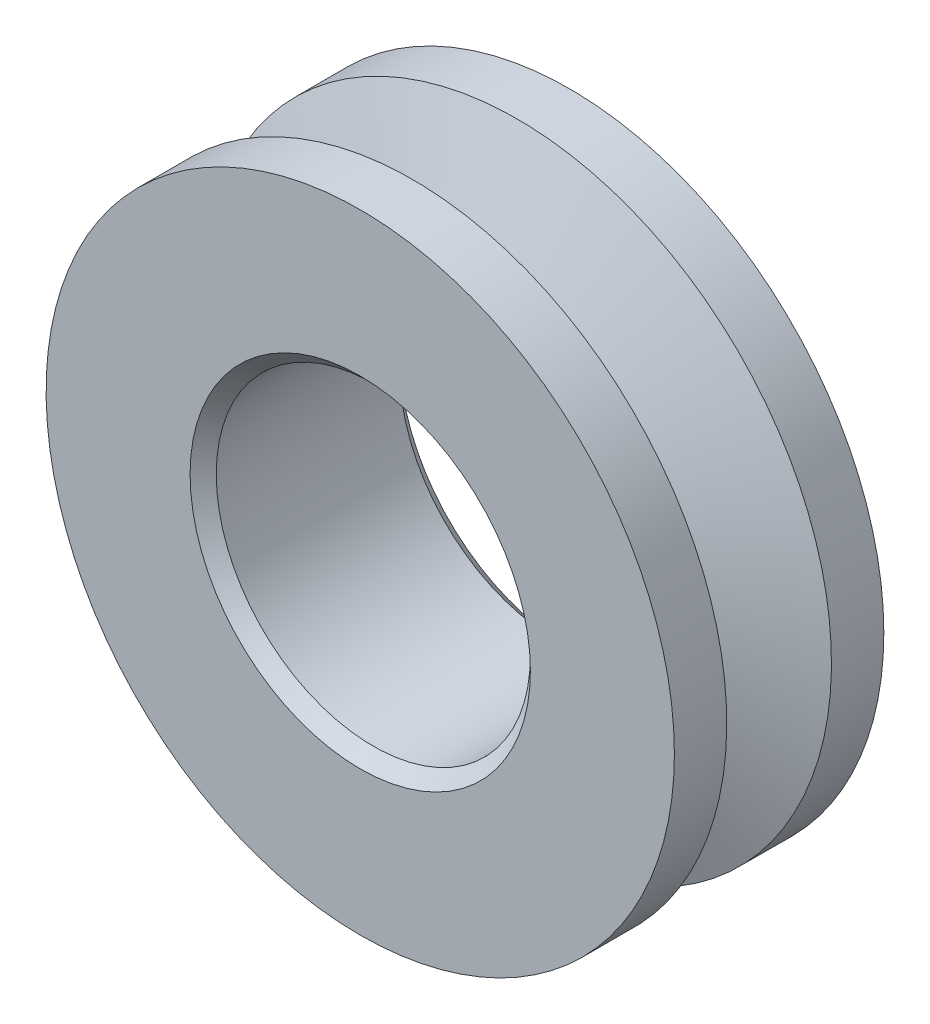
ISO-10303-21;
HEADER;
FILE_DESCRIPTION(('STEP AP214'),'2;1');
FILE_NAME('part.step','',(''),(''),'','','');
FILE_SCHEMA(('AUTOMOTIVE_DESIGN { 1 0 10303 214 1 1 1 1 }'));
ENDSEC;
DATA;
#1=APPLICATION_CONTEXT('core data for automotive mechanical design processes');
#2=APPLICATION_PROTOCOL_DEFINITION('international standard','automotive_design',2000,#1);
#3=PRODUCT_CONTEXT('',#1,'mechanical');
#4=PRODUCT('Part','Part','',(#3));
#5=PRODUCT_RELATED_PRODUCT_CATEGORY('part','',(#4));
#6=PRODUCT_DEFINITION_FORMATION('','',#4);
#7=PRODUCT_DEFINITION_CONTEXT('part definition',#1,'design');
#8=PRODUCT_DEFINITION('design','',#6,#7);
#9=PRODUCT_DEFINITION_SHAPE('','',#8);
#10=(LENGTH_UNIT() NAMED_UNIT(*) SI_UNIT(.MILLI.,.METRE.));
#11=(NAMED_UNIT(*) PLANE_ANGLE_UNIT() SI_UNIT($,.RADIAN.));
#12=(NAMED_UNIT(*) SI_UNIT($,.STERADIAN.) SOLID_ANGLE_UNIT());
#13=UNCERTAINTY_MEASURE_WITH_UNIT(LENGTH_MEASURE(1.E-05),#10,'distance_accuracy_value','');
#14=(GEOMETRIC_REPRESENTATION_CONTEXT(3) GLOBAL_UNCERTAINTY_ASSIGNED_CONTEXT((#13)) GLOBAL_UNIT_ASSIGNED_CONTEXT((#10,
#11,#12)) REPRESENTATION_CONTEXT('',''));
#15=CARTESIAN_POINT('',(0.,0.,0.));
#16=DIRECTION('',(0.,0.,1.));
#17=DIRECTION('',(1.,0.,0.));
#18=AXIS2_PLACEMENT_3D('',#15,#16,#17);
#19=CARTESIAN_POINT('',(0.,0.,6.35));
#20=DIRECTION('',(0.,0.,-1.));
#21=DIRECTION('',(-1.,0.,0.));
#22=AXIS2_PLACEMENT_3D('',#19,#20,#21);
#23=CYLINDRICAL_SURFACE('',#22,19.05);
#24=CARTESIAN_POINT('',(0.,0.,6.35));
#25=DIRECTION('',(0.,0.,1.));
#26=DIRECTION('',(1.,0.,0.));
#27=AXIS2_PLACEMENT_3D('',#24,#25,#26);
#28=CIRCLE('',#27,19.05);
#29=CARTESIAN_POINT('',(19.05,0.,6.35));
#30=VERTEX_POINT('',#29);
#31=EDGE_CURVE('E53',#30,#30,#28,.T.);
#32=ORIENTED_EDGE('',*,*,#31,.F.);
#33=EDGE_LOOP('',(#32));
#34=FACE_BOUND('',#33,.T.);
#35=CARTESIAN_POINT('',(0.,0.,3.17500000000002));
#36=DIRECTION('',(0.,0.,1.));
#37=DIRECTION('',(0.,-1.,0.));
#38=AXIS2_PLACEMENT_3D('',#35,#36,#37);
#39=CIRCLE('',#38,19.05);
#40=CARTESIAN_POINT('',(0.,-19.05,3.17500000000004));
#41=VERTEX_POINT('',#40);
#42=EDGE_CURVE('E57',#41,#41,#39,.T.);
#43=ORIENTED_EDGE('',*,*,#42,.T.);
#44=EDGE_LOOP('',(#43));
#45=FACE_BOUND('',#44,.T.);
#46=ADVANCED_FACE('F33',(#34,#45),#23,.T.);
#47=CARTESIAN_POINT('',(0.,0.,-6.35));
#48=DIRECTION('',(0.,0.,1.));
#49=DIRECTION('',(1.,0.,0.));
#50=AXIS2_PLACEMENT_3D('',#47,#48,#49);
#51=CIRCLE('',#50,19.05);
#52=CARTESIAN_POINT('',(19.05,0.,-6.35));
#53=VERTEX_POINT('',#52);
#54=EDGE_CURVE('E54',#53,#53,#51,.T.);
#55=ORIENTED_EDGE('',*,*,#54,.T.);
#56=EDGE_LOOP('',(#55));
#57=FACE_BOUND('',#56,.T.);
#58=CARTESIAN_POINT('',(0.,0.,-3.17499999999998));
#59=DIRECTION('',(0.,0.,1.));
#60=DIRECTION('',(0.,-1.,0.));
#61=AXIS2_PLACEMENT_3D('',#58,#59,#60);
#62=CIRCLE('',#61,19.05);
#63=CARTESIAN_POINT('',(0.,-19.05,-3.17499999999996));
#64=VERTEX_POINT('',#63);
#65=EDGE_CURVE('E62',#64,#64,#62,.T.);
#66=ORIENTED_EDGE('',*,*,#65,.F.);
#67=EDGE_LOOP('',(#66));
#68=FACE_BOUND('',#67,.T.);
#69=ADVANCED_FACE('F86',(#57,#68),#23,.T.);
#70=CARTESIAN_POINT('',(0.,0.,6.35));
#71=DIRECTION('',(0.,0.,1.));
#72=DIRECTION('',(1.,0.,0.));
#73=AXIS2_PLACEMENT_3D('',#70,#71,#72);
#74=PLANE('',#73);
#75=CARTESIAN_POINT('',(0.,0.,6.35));
#76=DIRECTION('',(0.,0.,1.));
#77=DIRECTION('',(1.,0.,0.));
#78=AXIS2_PLACEMENT_3D('',#75,#76,#77);
#79=CIRCLE('',#78,10.31875);
#80=CARTESIAN_POINT('',(10.31875,0.,6.35));
#81=VERTEX_POINT('',#80);
#82=EDGE_CURVE('E10',#81,#81,#79,.F.);
#83=ORIENTED_EDGE('',*,*,#82,.T.);
#84=EDGE_LOOP('',(#83));
#85=FACE_BOUND('',#84,.T.);
#86=ORIENTED_EDGE('',*,*,#31,.T.);
#87=EDGE_LOOP('',(#86));
#88=FACE_BOUND('',#87,.T.);
#89=ADVANCED_FACE('F92',(#85,#88),#74,.T.);
#90=CARTESIAN_POINT('',(0.,0.,-6.35));
#91=DIRECTION('',(0.,0.,1.));
#92=DIRECTION('',(1.,0.,0.));
#93=AXIS2_PLACEMENT_3D('',#90,#91,#92);
#94=PLANE('',#93);
#95=CARTESIAN_POINT('',(0.,0.,-6.35));
#96=DIRECTION('',(0.,0.,1.));
#97=DIRECTION('',(1.,0.,0.));
#98=AXIS2_PLACEMENT_3D('',#95,#96,#97);
#99=CIRCLE('',#98,10.31875);
#100=CARTESIAN_POINT('',(10.31875,0.,-6.35));
#101=VERTEX_POINT('',#100);
#102=EDGE_CURVE('E48',#101,#101,#99,.T.);
#103=ORIENTED_EDGE('',*,*,#102,.T.);
#104=EDGE_LOOP('',(#103));
#105=FACE_BOUND('',#104,.T.);
#106=ORIENTED_EDGE('',*,*,#54,.F.);
#107=EDGE_LOOP('',(#106));
#108=FACE_BOUND('',#107,.T.);
#109=ADVANCED_FACE('F97',(#105,#108),#94,.F.);
#110=CARTESIAN_POINT('',(0.,0.,6.35));
#111=DIRECTION('',(0.,0.,-1.));
#112=DIRECTION('',(-1.,0.,0.));
#113=AXIS2_PLACEMENT_3D('',#110,#111,#112);
#114=CYLINDRICAL_SURFACE('',#113,9.525);
#115=CARTESIAN_POINT('',(0.,0.,-5.55624999999999));
#116=DIRECTION('',(0.,0.,1.));
#117=DIRECTION('',(1.,0.,0.));
#118=AXIS2_PLACEMENT_3D('',#115,#116,#117);
#119=CIRCLE('',#118,9.525);
#120=CARTESIAN_POINT('',(9.525,0.,-5.55624999999999));
#121=VERTEX_POINT('',#120);
#122=EDGE_CURVE('E40',#121,#121,#119,.F.);
#123=ORIENTED_EDGE('',*,*,#122,.T.);
#124=EDGE_LOOP('',(#123));
#125=FACE_BOUND('',#124,.T.);
#126=CARTESIAN_POINT('',(0.,0.,5.55625000000001));
#127=DIRECTION('',(0.,0.,1.));
#128=DIRECTION('',(1.,0.,0.));
#129=AXIS2_PLACEMENT_3D('',#126,#127,#128);
#130=CIRCLE('',#129,9.525);
#131=CARTESIAN_POINT('',(9.525,0.,5.55625000000001));
#132=VERTEX_POINT('',#131);
#133=EDGE_CURVE('E44',#132,#132,#130,.T.);
#134=ORIENTED_EDGE('',*,*,#133,.T.);
#135=EDGE_LOOP('',(#134));
#136=FACE_BOUND('',#135,.T.);
#137=ADVANCED_FACE('F101',(#125,#136),#114,.F.);
#138=CARTESIAN_POINT('',(0.,0.,-6.35));
#139=DIRECTION('',(0.,0.,-1.));
#140=DIRECTION('',(-1.,0.,0.));
#141=AXIS2_PLACEMENT_3D('',#138,#139,#140);
#142=CONICAL_SURFACE('',#141,10.31875,0.785398163397444);
#143=ORIENTED_EDGE('',*,*,#122,.F.);
#144=EDGE_LOOP('',(#143));
#145=FACE_BOUND('',#144,.T.);
#146=ORIENTED_EDGE('',*,*,#102,.F.);
#147=EDGE_LOOP('',(#146));
#148=FACE_BOUND('',#147,.T.);
#149=ADVANCED_FACE('F99',(#145,#148),#142,.F.);
#150=CARTESIAN_POINT('',(0.,0.,5.55625000000001));
#151=DIRECTION('',(0.,0.,1.));
#152=DIRECTION('',(1.,0.,0.));
#153=AXIS2_PLACEMENT_3D('',#150,#151,#152);
#154=CONICAL_SURFACE('',#153,9.525,0.78539816339745);
#155=ORIENTED_EDGE('',*,*,#82,.F.);
#156=EDGE_LOOP('',(#155));
#157=FACE_BOUND('',#156,.T.);
#158=ORIENTED_EDGE('',*,*,#133,.F.);
#159=EDGE_LOOP('',(#158));
#160=FACE_BOUND('',#159,.T.);
#161=ADVANCED_FACE('F35',(#157,#160),#154,.F.);
#162=CARTESIAN_POINT('',(0.,0.,3.17500000000002));
#163=DIRECTION('',(0.,0.,1.));
#164=DIRECTION('',(0.,-1.,0.));
#165=AXIS2_PLACEMENT_3D('',#162,#163,#164);
#166=CONICAL_SURFACE('',#165,19.05,1.22173047639603);
#167=CARTESIAN_POINT('',(0.,0.,0.863789012409648));
#168=DIRECTION('',(0.,0.,1.));
#169=DIRECTION('',(0.,-1.,0.));
#170=AXIS2_PLACEMENT_3D('',#167,#168,#169);
#171=CIRCLE('',#170,12.7);
#172=CARTESIAN_POINT('',(0.,-12.7,0.863789012409662));
#173=VERTEX_POINT('',#172);
#174=EDGE_CURVE('E68',#173,#173,#171,.T.);
#175=ORIENTED_EDGE('',*,*,#174,.T.);
#176=EDGE_LOOP('',(#175));
#177=FACE_BOUND('',#176,.T.);
#178=ORIENTED_EDGE('',*,*,#42,.F.);
#179=EDGE_LOOP('',(#178));
#180=FACE_BOUND('',#179,.T.);
#181=ADVANCED_FACE('F72',(#177,#180),#166,.T.);
#182=CARTESIAN_POINT('',(0.,0.,-0.86378901240962));
#183=DIRECTION('',(0.,0.,-1.));
#184=DIRECTION('',(0.,1.,0.));
#185=AXIS2_PLACEMENT_3D('',#182,#183,#184);
#186=CONICAL_SURFACE('',#185,12.7,1.22173047639603);
#187=ORIENTED_EDGE('',*,*,#65,.T.);
#188=EDGE_LOOP('',(#187));
#189=FACE_BOUND('',#188,.T.);
#190=CARTESIAN_POINT('',(0.,0.,-0.86378901240962));
#191=DIRECTION('',(0.,0.,1.));
#192=DIRECTION('',(0.,-1.,0.));
#193=AXIS2_PLACEMENT_3D('',#190,#191,#192);
#194=CIRCLE('',#193,12.7);
#195=CARTESIAN_POINT('',(0.,-12.7,-0.863789012409607));
#196=VERTEX_POINT('',#195);
#197=EDGE_CURVE('E65',#196,#196,#194,.T.);
#198=ORIENTED_EDGE('',*,*,#197,.F.);
#199=EDGE_LOOP('',(#198));
#200=FACE_BOUND('',#199,.T.);
#201=ADVANCED_FACE('F77',(#189,#200),#186,.T.);
#202=CARTESIAN_POINT('',(0.,0.,6.35));
#203=DIRECTION('',(0.,0.,1.));
#204=DIRECTION('',(0.,-1.,0.));
#205=AXIS2_PLACEMENT_3D('',#202,#203,#204);
#206=CYLINDRICAL_SURFACE('',#205,12.7);
#207=ORIENTED_EDGE('',*,*,#197,.T.);
#208=EDGE_LOOP('',(#207));
#209=FACE_BOUND('',#208,.T.);
#210=ORIENTED_EDGE('',*,*,#174,.F.);
#211=EDGE_LOOP('',(#210));
#212=FACE_BOUND('',#211,.T.);
#213=ADVANCED_FACE('F75',(#209,#212),#206,.T.);
#214=CLOSED_SHELL('',(#46,#69,#89,#109,#137,#149,#161,#181,#201,#213));
#215=MANIFOLD_SOLID_BREP('B2',#214);
#216=ADVANCED_BREP_SHAPE_REPRESENTATION('',(#18,#215),#14);
#217=SHAPE_DEFINITION_REPRESENTATION(#9,#216);
ENDSEC;
END-ISO-10303-21;
